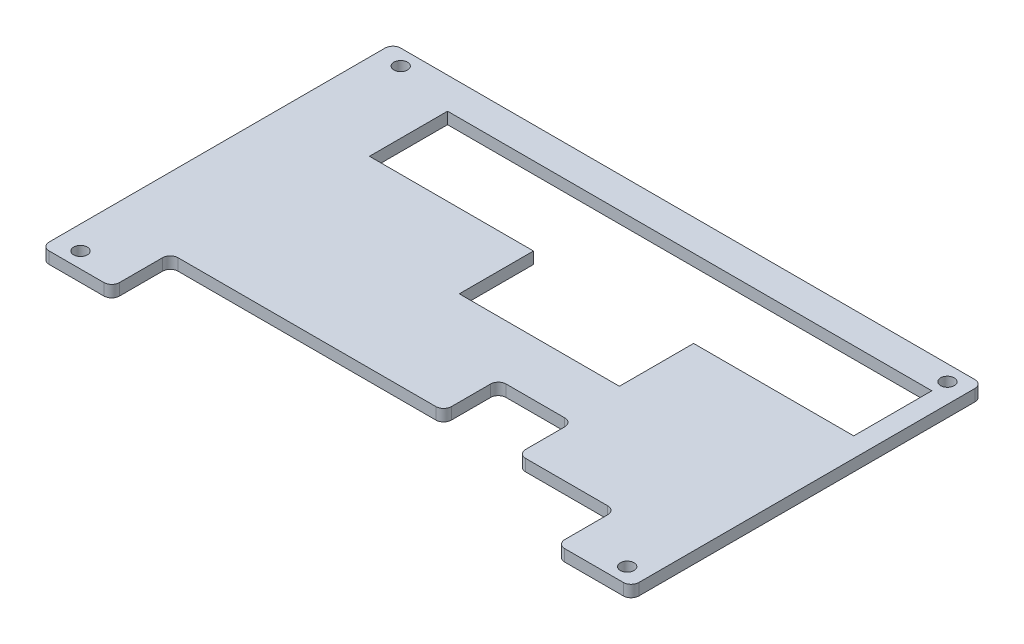
ISO-10303-21;
HEADER;
FILE_DESCRIPTION(('STEP AP214'),'2;1');
FILE_NAME('part.step','',(''),(''),'','','');
FILE_SCHEMA(('AUTOMOTIVE_DESIGN { 1 0 10303 214 1 1 1 1 }'));
ENDSEC;
DATA;
#1=APPLICATION_CONTEXT('core data for automotive mechanical design processes');
#2=APPLICATION_PROTOCOL_DEFINITION('international standard','automotive_design',2000,#1);
#3=PRODUCT_CONTEXT('',#1,'mechanical');
#4=PRODUCT('Part','Part','',(#3));
#5=PRODUCT_RELATED_PRODUCT_CATEGORY('part','',(#4));
#6=PRODUCT_DEFINITION_FORMATION('','',#4);
#7=PRODUCT_DEFINITION_CONTEXT('part definition',#1,'design');
#8=PRODUCT_DEFINITION('design','',#6,#7);
#9=PRODUCT_DEFINITION_SHAPE('','',#8);
#10=(LENGTH_UNIT() NAMED_UNIT(*) SI_UNIT(.MILLI.,.METRE.));
#11=(NAMED_UNIT(*) PLANE_ANGLE_UNIT() SI_UNIT($,.RADIAN.));
#12=(NAMED_UNIT(*) SI_UNIT($,.STERADIAN.) SOLID_ANGLE_UNIT());
#13=UNCERTAINTY_MEASURE_WITH_UNIT(LENGTH_MEASURE(1.E-05),#10,'distance_accuracy_value','');
#14=(GEOMETRIC_REPRESENTATION_CONTEXT(3) GLOBAL_UNCERTAINTY_ASSIGNED_CONTEXT((#13)) GLOBAL_UNIT_ASSIGNED_CONTEXT((#10,
#11,#12)) REPRESENTATION_CONTEXT('',''));
#15=CARTESIAN_POINT('',(0.,0.,0.));
#16=DIRECTION('',(0.,0.,1.));
#17=DIRECTION('',(1.,0.,0.));
#18=AXIS2_PLACEMENT_3D('',#15,#16,#17);
#19=CARTESIAN_POINT('',(0.,3.,0.));
#20=DIRECTION('',(0.,0.,-1.));
#21=DIRECTION('',(-1.,0.,0.));
#22=AXIS2_PLACEMENT_3D('',#19,#20,#21);
#23=PLANE('',#22);
#24=DIRECTION('',(1.,0.,0.));
#25=VECTOR('',#24,1.);
#26=CARTESIAN_POINT('',(0.,0.,0.));
#27=LINE('',#26,#25);
#28=CARTESIAN_POINT('',(2.,0.,0.));
#29=VERTEX_POINT('',#28);
#30=CARTESIAN_POINT('',(16.,0.,0.));
#31=VERTEX_POINT('',#30);
#32=EDGE_CURVE('E463',#29,#31,#27,.T.);
#33=ORIENTED_EDGE('',*,*,#32,.T.);
#34=DIRECTION('',(0.,1.,0.));
#35=VECTOR('',#34,1.);
#36=CARTESIAN_POINT('',(16.,3.,0.));
#37=LINE('',#36,#35);
#38=CARTESIAN_POINT('',(16.,3.,0.));
#39=VERTEX_POINT('',#38);
#40=EDGE_CURVE('E601',#31,#39,#37,.T.);
#41=ORIENTED_EDGE('',*,*,#40,.T.);
#42=DIRECTION('',(1.,0.,0.));
#43=VECTOR('',#42,1.);
#44=CARTESIAN_POINT('',(0.,3.,0.));
#45=LINE('',#44,#43);
#46=CARTESIAN_POINT('',(2.,3.,0.));
#47=VERTEX_POINT('',#46);
#48=EDGE_CURVE('E446',#47,#39,#45,.T.);
#49=ORIENTED_EDGE('',*,*,#48,.F.);
#50=DIRECTION('',(0.,-1.,0.));
#51=VECTOR('',#50,1.);
#52=CARTESIAN_POINT('',(2.,3.,0.));
#53=LINE('',#52,#51);
#54=EDGE_CURVE('E512',#47,#29,#53,.T.);
#55=ORIENTED_EDGE('',*,*,#54,.T.);
#56=EDGE_LOOP('',(#33,#41,#49,#55));
#57=FACE_BOUND('',#56,.T.);
#58=ADVANCED_FACE('F45',(#57),#23,.F.);
#59=CARTESIAN_POINT('',(0.,3.,0.));
#60=DIRECTION('',(1.,0.,0.));
#61=DIRECTION('',(0.,0.,-1.));
#62=AXIS2_PLACEMENT_3D('',#59,#60,#61);
#63=PLANE('',#62);
#64=DIRECTION('',(0.,0.,1.));
#65=VECTOR('',#64,1.);
#66=CARTESIAN_POINT('',(0.,0.,0.));
#67=LINE('',#66,#65);
#68=CARTESIAN_POINT('',(0.,0.,-88.));
#69=VERTEX_POINT('',#68);
#70=CARTESIAN_POINT('',(0.,0.,-2.));
#71=VERTEX_POINT('',#70);
#72=EDGE_CURVE('E436',#69,#71,#67,.T.);
#73=ORIENTED_EDGE('',*,*,#72,.T.);
#74=DIRECTION('',(0.,-1.,0.));
#75=VECTOR('',#74,1.);
#76=CARTESIAN_POINT('',(0.,3.,-2.));
#77=LINE('',#76,#75);
#78=CARTESIAN_POINT('',(0.,3.,-2.));
#79=VERTEX_POINT('',#78);
#80=EDGE_CURVE('E524',#71,#79,#77,.F.);
#81=ORIENTED_EDGE('',*,*,#80,.T.);
#82=DIRECTION('',(0.,0.,1.));
#83=VECTOR('',#82,1.);
#84=CARTESIAN_POINT('',(0.,3.,0.));
#85=LINE('',#84,#83);
#86=CARTESIAN_POINT('',(0.,3.,-88.));
#87=VERTEX_POINT('',#86);
#88=EDGE_CURVE('E440',#87,#79,#85,.T.);
#89=ORIENTED_EDGE('',*,*,#88,.F.);
#90=DIRECTION('',(0.,-1.,0.));
#91=VECTOR('',#90,1.);
#92=CARTESIAN_POINT('',(0.,3.,-88.));
#93=LINE('',#92,#91);
#94=EDGE_CURVE('E520',#87,#69,#93,.T.);
#95=ORIENTED_EDGE('',*,*,#94,.T.);
#96=EDGE_LOOP('',(#73,#81,#89,#95));
#97=FACE_BOUND('',#96,.T.);
#98=ADVANCED_FACE('F653',(#97),#63,.F.);
#99=CARTESIAN_POINT('',(134.,3.,0.));
#100=VERTEX_POINT('',#99);
#101=CARTESIAN_POINT('',(149.,3.,0.));
#102=VERTEX_POINT('',#101);
#103=EDGE_CURVE('E444',#100,#102,#45,.T.);
#104=ORIENTED_EDGE('',*,*,#103,.F.);
#105=DIRECTION('',(0.,1.,0.));
#106=VECTOR('',#105,1.);
#107=CARTESIAN_POINT('',(134.,3.,0.));
#108=LINE('',#107,#106);
#109=CARTESIAN_POINT('',(134.,0.,0.));
#110=VERTEX_POINT('',#109);
#111=EDGE_CURVE('E546',#100,#110,#108,.F.);
#112=ORIENTED_EDGE('',*,*,#111,.T.);
#113=CARTESIAN_POINT('',(149.,0.,0.));
#114=VERTEX_POINT('',#113);
#115=EDGE_CURVE('E462',#110,#114,#27,.T.);
#116=ORIENTED_EDGE('',*,*,#115,.T.);
#117=DIRECTION('',(0.,-1.,0.));
#118=VECTOR('',#117,1.);
#119=CARTESIAN_POINT('',(149.,3.,0.));
#120=LINE('',#119,#118);
#121=EDGE_CURVE('E516',#114,#102,#120,.F.);
#122=ORIENTED_EDGE('',*,*,#121,.T.);
#123=EDGE_LOOP('',(#104,#112,#116,#122));
#124=FACE_BOUND('',#123,.T.);
#125=ADVANCED_FACE('F737',(#124),#23,.F.);
#126=CARTESIAN_POINT('',(151.,3.,0.));
#127=DIRECTION('',(-1.,0.,0.));
#128=DIRECTION('',(0.,0.,1.));
#129=AXIS2_PLACEMENT_3D('',#126,#127,#128);
#130=PLANE('',#129);
#131=DIRECTION('',(0.,0.,-1.));
#132=VECTOR('',#131,1.);
#133=CARTESIAN_POINT('',(151.,0.,0.));
#134=LINE('',#133,#132);
#135=CARTESIAN_POINT('',(151.,0.,-2.));
#136=VERTEX_POINT('',#135);
#137=CARTESIAN_POINT('',(151.,0.,-88.));
#138=VERTEX_POINT('',#137);
#139=EDGE_CURVE('E467',#136,#138,#134,.T.);
#140=ORIENTED_EDGE('',*,*,#139,.T.);
#141=DIRECTION('',(0.,-1.,0.));
#142=VECTOR('',#141,1.);
#143=CARTESIAN_POINT('',(151.,3.,-88.));
#144=LINE('',#143,#142);
#145=CARTESIAN_POINT('',(151.,3.,-88.));
#146=VERTEX_POINT('',#145);
#147=EDGE_CURVE('E497',#138,#146,#144,.F.);
#148=ORIENTED_EDGE('',*,*,#147,.T.);
#149=DIRECTION('',(0.,0.,-1.));
#150=VECTOR('',#149,1.);
#151=CARTESIAN_POINT('',(151.,3.,0.));
#152=LINE('',#151,#150);
#153=CARTESIAN_POINT('',(151.,3.,-2.));
#154=VERTEX_POINT('',#153);
#155=EDGE_CURVE('E450',#154,#146,#152,.T.);
#156=ORIENTED_EDGE('',*,*,#155,.F.);
#157=DIRECTION('',(0.,-1.,0.));
#158=VECTOR('',#157,1.);
#159=CARTESIAN_POINT('',(151.,3.,-2.));
#160=LINE('',#159,#158);
#161=EDGE_CURVE('E493',#154,#136,#160,.T.);
#162=ORIENTED_EDGE('',*,*,#161,.T.);
#163=EDGE_LOOP('',(#140,#148,#156,#162));
#164=FACE_BOUND('',#163,.T.);
#165=ADVANCED_FACE('F671',(#164),#130,.F.);
#166=CARTESIAN_POINT('',(0.,3.,-90.));
#167=DIRECTION('',(0.,0.,1.));
#168=DIRECTION('',(1.,0.,0.));
#169=AXIS2_PLACEMENT_3D('',#166,#167,#168);
#170=PLANE('',#169);
#171=DIRECTION('',(-1.,0.,0.));
#172=VECTOR('',#171,1.);
#173=CARTESIAN_POINT('',(0.,3.,-90.));
#174=LINE('',#173,#172);
#175=CARTESIAN_POINT('',(149.,3.,-90.));
#176=VERTEX_POINT('',#175);
#177=CARTESIAN_POINT('',(2.,3.,-90.));
#178=VERTEX_POINT('',#177);
#179=EDGE_CURVE('E454',#176,#178,#174,.T.);
#180=ORIENTED_EDGE('',*,*,#179,.F.);
#181=DIRECTION('',(0.,-1.,0.));
#182=VECTOR('',#181,1.);
#183=CARTESIAN_POINT('',(149.,3.,-90.));
#184=LINE('',#183,#182);
#185=CARTESIAN_POINT('',(149.,0.,-90.));
#186=VERTEX_POINT('',#185);
#187=EDGE_CURVE('E476',#176,#186,#184,.T.);
#188=ORIENTED_EDGE('',*,*,#187,.T.);
#189=DIRECTION('',(-1.,0.,0.));
#190=VECTOR('',#189,1.);
#191=CARTESIAN_POINT('',(0.,0.,-90.));
#192=LINE('',#191,#190);
#193=CARTESIAN_POINT('',(2.,0.,-90.));
#194=VERTEX_POINT('',#193);
#195=EDGE_CURVE('E445',#186,#194,#192,.T.);
#196=ORIENTED_EDGE('',*,*,#195,.T.);
#197=DIRECTION('',(0.,-1.,0.));
#198=VECTOR('',#197,1.);
#199=CARTESIAN_POINT('',(2.,3.,-90.));
#200=LINE('',#199,#198);
#201=EDGE_CURVE('E458',#194,#178,#200,.F.);
#202=ORIENTED_EDGE('',*,*,#201,.T.);
#203=EDGE_LOOP('',(#180,#188,#196,#202));
#204=FACE_BOUND('',#203,.T.);
#205=ADVANCED_FACE('F663',(#204),#170,.F.);
#206=CARTESIAN_POINT('',(0.,3.,0.));
#207=DIRECTION('',(0.,-1.,0.));
#208=DIRECTION('',(0.,0.,-1.));
#209=AXIS2_PLACEMENT_3D('',#206,#207,#208);
#210=PLANE('',#209);
#211=DIRECTION('',(1.,0.,0.));
#212=VECTOR('',#211,1.);
#213=CARTESIAN_POINT('',(22.,3.,-62.));
#214=LINE('',#213,#212);
#215=CARTESIAN_POINT('',(22.,3.,-62.));
#216=VERTEX_POINT('',#215);
#217=CARTESIAN_POINT('',(64.,3.,-62.));
#218=VERTEX_POINT('',#217);
#219=EDGE_CURVE('E312',#216,#218,#214,.T.);
#220=ORIENTED_EDGE('',*,*,#219,.F.);
#221=DIRECTION('',(0.,0.,1.));
#222=VECTOR('',#221,1.);
#223=CARTESIAN_POINT('',(22.,3.,-82.));
#224=LINE('',#223,#222);
#225=CARTESIAN_POINT('',(22.,3.,-82.));
#226=VERTEX_POINT('',#225);
#227=EDGE_CURVE('E263',#226,#216,#224,.T.);
#228=ORIENTED_EDGE('',*,*,#227,.F.);
#229=DIRECTION('',(-1.,0.,0.));
#230=VECTOR('',#229,1.);
#231=CARTESIAN_POINT('',(22.,3.,-82.));
#232=LINE('',#231,#230);
#233=CARTESIAN_POINT('',(146.,3.,-82.));
#234=VERTEX_POINT('',#233);
#235=EDGE_CURVE('E284',#234,#226,#232,.T.);
#236=ORIENTED_EDGE('',*,*,#235,.F.);
#237=DIRECTION('',(0.,0.,-1.));
#238=VECTOR('',#237,1.);
#239=CARTESIAN_POINT('',(146.,3.,-82.));
#240=LINE('',#239,#238);
#241=CARTESIAN_POINT('',(146.,3.,-62.));
#242=VERTEX_POINT('',#241);
#243=EDGE_CURVE('E288',#242,#234,#240,.T.);
#244=ORIENTED_EDGE('',*,*,#243,.F.);
#245=DIRECTION('',(1.,0.,0.));
#246=VECTOR('',#245,1.);
#247=CARTESIAN_POINT('',(105.,3.,-62.));
#248=LINE('',#247,#246);
#249=CARTESIAN_POINT('',(105.,3.,-62.));
#250=VERTEX_POINT('',#249);
#251=EDGE_CURVE('E328',#250,#242,#248,.T.);
#252=ORIENTED_EDGE('',*,*,#251,.F.);
#253=DIRECTION('',(0.,0.,-1.));
#254=VECTOR('',#253,1.);
#255=CARTESIAN_POINT('',(105.,3.,-62.));
#256=LINE('',#255,#254);
#257=CARTESIAN_POINT('',(105.,3.,-43.));
#258=VERTEX_POINT('',#257);
#259=EDGE_CURVE('E324',#258,#250,#256,.T.);
#260=ORIENTED_EDGE('',*,*,#259,.F.);
#261=DIRECTION('',(1.,0.,0.));
#262=VECTOR('',#261,1.);
#263=CARTESIAN_POINT('',(64.,3.,-43.));
#264=LINE('',#263,#262);
#265=CARTESIAN_POINT('',(64.,3.,-43.));
#266=VERTEX_POINT('',#265);
#267=EDGE_CURVE('E320',#266,#258,#264,.T.);
#268=ORIENTED_EDGE('',*,*,#267,.F.);
#269=DIRECTION('',(0.,0.,1.));
#270=VECTOR('',#269,1.);
#271=CARTESIAN_POINT('',(64.,3.,-62.));
#272=LINE('',#271,#270);
#273=EDGE_CURVE('E316',#218,#266,#272,.T.);
#274=ORIENTED_EDGE('',*,*,#273,.F.);
#275=EDGE_LOOP('',(#220,#228,#236,#244,#252,#260,#268,#274));
#276=FACE_BOUND('',#275,.T.);
#277=CARTESIAN_POINT('',(146.,3.,-4.));
#278=DIRECTION('',(0.,1.,0.));
#279=DIRECTION('',(0.,0.,1.));
#280=AXIS2_PLACEMENT_3D('',#277,#278,#279);
#281=CIRCLE('',#280,1.75000000000001);
#282=CARTESIAN_POINT('',(146.,3.,-2.24999999999999));
#283=VERTEX_POINT('',#282);
#284=EDGE_CURVE('E416',#283,#283,#281,.T.);
#285=ORIENTED_EDGE('',*,*,#284,.F.);
#286=EDGE_LOOP('',(#285));
#287=FACE_BOUND('',#286,.T.);
#288=CARTESIAN_POINT('',(6.,3.,-86.));
#289=DIRECTION('',(0.,1.,0.));
#290=DIRECTION('',(0.,0.,1.));
#291=AXIS2_PLACEMENT_3D('',#288,#289,#290);
#292=CIRCLE('',#291,1.75);
#293=CARTESIAN_POINT('',(6.,3.,-84.25));
#294=VERTEX_POINT('',#293);
#295=EDGE_CURVE('E425',#294,#294,#292,.T.);
#296=ORIENTED_EDGE('',*,*,#295,.F.);
#297=EDGE_LOOP('',(#296));
#298=FACE_BOUND('',#297,.T.);
#299=CARTESIAN_POINT('',(6.,3.,-4.));
#300=DIRECTION('',(0.,1.,0.));
#301=DIRECTION('',(0.,0.,1.));
#302=AXIS2_PLACEMENT_3D('',#299,#300,#301);
#303=CIRCLE('',#302,1.75);
#304=CARTESIAN_POINT('',(6.,3.,-2.25));
#305=VERTEX_POINT('',#304);
#306=EDGE_CURVE('E408',#305,#305,#303,.T.);
#307=ORIENTED_EDGE('',*,*,#306,.F.);
#308=EDGE_LOOP('',(#307));
#309=FACE_BOUND('',#308,.T.);
#310=CARTESIAN_POINT('',(146.,3.,-86.));
#311=DIRECTION('',(0.,1.,0.));
#312=DIRECTION('',(0.,0.,1.));
#313=AXIS2_PLACEMENT_3D('',#310,#311,#312);
#314=CIRCLE('',#313,1.75000000000001);
#315=CARTESIAN_POINT('',(146.,3.,-84.25));
#316=VERTEX_POINT('',#315);
#317=EDGE_CURVE('E420',#316,#316,#314,.T.);
#318=ORIENTED_EDGE('',*,*,#317,.F.);
#319=EDGE_LOOP('',(#318));
#320=FACE_BOUND('',#319,.T.);
#321=DIRECTION('',(0.,0.,-1.));
#322=VECTOR('',#321,1.);
#323=CARTESIAN_POINT('',(132.,3.,0.));
#324=LINE('',#323,#322);
#325=CARTESIAN_POINT('',(132.,3.,-2.));
#326=VERTEX_POINT('',#325);
#327=CARTESIAN_POINT('',(132.,3.,-13.));
#328=VERTEX_POINT('',#327);
#329=EDGE_CURVE('E376',#326,#328,#324,.T.);
#330=ORIENTED_EDGE('',*,*,#329,.F.);
#331=CARTESIAN_POINT('',(134.,3.,-2.));
#332=DIRECTION('',(0.,-1.,0.));
#333=DIRECTION('',(0.,0.,-1.));
#334=AXIS2_PLACEMENT_3D('',#331,#332,#333);
#335=CIRCLE('',#334,2.);
#336=EDGE_CURVE('E543',#326,#100,#335,.F.);
#337=ORIENTED_EDGE('',*,*,#336,.T.);
#338=ORIENTED_EDGE('',*,*,#103,.T.);
#339=CARTESIAN_POINT('',(149.,3.,-2.));
#340=DIRECTION('',(0.,-1.,0.));
#341=DIRECTION('',(0.,0.,-1.));
#342=AXIS2_PLACEMENT_3D('',#339,#340,#341);
#343=CIRCLE('',#342,2.);
#344=EDGE_CURVE('E506',#102,#154,#343,.F.);
#345=ORIENTED_EDGE('',*,*,#344,.T.);
#346=ORIENTED_EDGE('',*,*,#155,.T.);
#347=CARTESIAN_POINT('',(149.,3.,-88.));
#348=DIRECTION('',(0.,-1.,0.));
#349=DIRECTION('',(0.,0.,-1.));
#350=AXIS2_PLACEMENT_3D('',#347,#348,#349);
#351=CIRCLE('',#350,2.);
#352=EDGE_CURVE('E509',#146,#176,#351,.F.);
#353=ORIENTED_EDGE('',*,*,#352,.T.);
#354=ORIENTED_EDGE('',*,*,#179,.T.);
#355=CARTESIAN_POINT('',(2.,3.,-88.));
#356=DIRECTION('',(0.,-1.,0.));
#357=DIRECTION('',(0.,0.,-1.));
#358=AXIS2_PLACEMENT_3D('',#355,#356,#357);
#359=CIRCLE('',#358,2.);
#360=EDGE_CURVE('E500',#178,#87,#359,.F.);
#361=ORIENTED_EDGE('',*,*,#360,.T.);
#362=ORIENTED_EDGE('',*,*,#88,.T.);
#363=CARTESIAN_POINT('',(2.,3.,-2.));
#364=DIRECTION('',(0.,-1.,0.));
#365=DIRECTION('',(0.,0.,-1.));
#366=AXIS2_PLACEMENT_3D('',#363,#364,#365);
#367=CIRCLE('',#366,2.);
#368=EDGE_CURVE('E503',#79,#47,#367,.F.);
#369=ORIENTED_EDGE('',*,*,#368,.T.);
#370=ORIENTED_EDGE('',*,*,#48,.T.);
#371=CARTESIAN_POINT('',(16.,3.,-2.));
#372=DIRECTION('',(0.,-1.,0.));
#373=DIRECTION('',(0.,0.,-1.));
#374=AXIS2_PLACEMENT_3D('',#371,#372,#373);
#375=CIRCLE('',#374,2.);
#376=CARTESIAN_POINT('',(18.,3.,-2.));
#377=VERTEX_POINT('',#376);
#378=EDGE_CURVE('E534',#39,#377,#375,.F.);
#379=ORIENTED_EDGE('',*,*,#378,.T.);
#380=DIRECTION('',(0.,0.,1.));
#381=VECTOR('',#380,1.);
#382=CARTESIAN_POINT('',(18.,3.,0.));
#383=LINE('',#382,#381);
#384=CARTESIAN_POINT('',(18.,3.,-13.));
#385=VERTEX_POINT('',#384);
#386=EDGE_CURVE('E313',#385,#377,#383,.T.);
#387=ORIENTED_EDGE('',*,*,#386,.F.);
#388=CARTESIAN_POINT('',(20.,3.,-13.));
#389=DIRECTION('',(0.,-1.,0.));
#390=DIRECTION('',(0.,0.,-1.));
#391=AXIS2_PLACEMENT_3D('',#388,#389,#390);
#392=CIRCLE('',#391,2.);
#393=CARTESIAN_POINT('',(20.,3.,-15.));
#394=VERTEX_POINT('',#393);
#395=EDGE_CURVE('E54',#385,#394,#392,.T.);
#396=ORIENTED_EDGE('',*,*,#395,.T.);
#397=DIRECTION('',(-1.,0.,0.));
#398=VECTOR('',#397,1.);
#399=CARTESIAN_POINT('',(18.,3.,-15.));
#400=LINE('',#399,#398);
#401=CARTESIAN_POINT('',(86.,3.,-15.));
#402=VERTEX_POINT('',#401);
#403=EDGE_CURVE('E356',#402,#394,#400,.T.);
#404=ORIENTED_EDGE('',*,*,#403,.F.);
#405=CARTESIAN_POINT('',(86.,3.,-17.));
#406=DIRECTION('',(0.,-1.,0.));
#407=DIRECTION('',(0.,0.,-1.));
#408=AXIS2_PLACEMENT_3D('',#405,#406,#407);
#409=CIRCLE('',#408,2.);
#410=CARTESIAN_POINT('',(88.,3.,-17.));
#411=VERTEX_POINT('',#410);
#412=EDGE_CURVE('E537',#402,#411,#409,.F.);
#413=ORIENTED_EDGE('',*,*,#412,.T.);
#414=DIRECTION('',(0.,0.,1.));
#415=VECTOR('',#414,1.);
#416=CARTESIAN_POINT('',(88.,3.,-15.));
#417=LINE('',#416,#415);
#418=CARTESIAN_POINT('',(88.,3.,-27.));
#419=VERTEX_POINT('',#418);
#420=EDGE_CURVE('E359',#419,#411,#417,.T.);
#421=ORIENTED_EDGE('',*,*,#420,.F.);
#422=CARTESIAN_POINT('',(90.,3.,-27.));
#423=DIRECTION('',(0.,-1.,0.));
#424=DIRECTION('',(0.,0.,-1.));
#425=AXIS2_PLACEMENT_3D('',#422,#423,#424);
#426=CIRCLE('',#425,2.);
#427=CARTESIAN_POINT('',(90.,3.,-29.));
#428=VERTEX_POINT('',#427);
#429=EDGE_CURVE('E617',#419,#428,#426,.T.);
#430=ORIENTED_EDGE('',*,*,#429,.T.);
#431=DIRECTION('',(-1.,0.,0.));
#432=VECTOR('',#431,1.);
#433=CARTESIAN_POINT('',(88.,3.,-29.));
#434=LINE('',#433,#432);
#435=CARTESIAN_POINT('',(105.,3.,-29.));
#436=VERTEX_POINT('',#435);
#437=EDGE_CURVE('E364',#436,#428,#434,.T.);
#438=ORIENTED_EDGE('',*,*,#437,.F.);
#439=CARTESIAN_POINT('',(105.,3.,-27.));
#440=DIRECTION('',(0.,-1.,0.));
#441=DIRECTION('',(0.,0.,-1.));
#442=AXIS2_PLACEMENT_3D('',#439,#440,#441);
#443=CIRCLE('',#442,2.);
#444=CARTESIAN_POINT('',(107.,3.,-27.));
#445=VERTEX_POINT('',#444);
#446=EDGE_CURVE('E611',#436,#445,#443,.T.);
#447=ORIENTED_EDGE('',*,*,#446,.T.);
#448=DIRECTION('',(0.,0.,-1.));
#449=VECTOR('',#448,1.);
#450=CARTESIAN_POINT('',(107.,3.,-15.));
#451=LINE('',#450,#449);
#452=CARTESIAN_POINT('',(107.,3.,-17.));
#453=VERTEX_POINT('',#452);
#454=EDGE_CURVE('E368',#453,#445,#451,.T.);
#455=ORIENTED_EDGE('',*,*,#454,.F.);
#456=CARTESIAN_POINT('',(109.,3.,-17.));
#457=DIRECTION('',(0.,-1.,0.));
#458=DIRECTION('',(0.,0.,-1.));
#459=AXIS2_PLACEMENT_3D('',#456,#457,#458);
#460=CIRCLE('',#459,2.);
#461=CARTESIAN_POINT('',(109.,3.,-15.));
#462=VERTEX_POINT('',#461);
#463=EDGE_CURVE('E540',#453,#462,#460,.F.);
#464=ORIENTED_EDGE('',*,*,#463,.T.);
#465=DIRECTION('',(-1.,0.,0.));
#466=VECTOR('',#465,1.);
#467=CARTESIAN_POINT('',(107.,3.,-15.));
#468=LINE('',#467,#466);
#469=CARTESIAN_POINT('',(130.,3.,-15.));
#470=VERTEX_POINT('',#469);
#471=EDGE_CURVE('E372',#470,#462,#468,.T.);
#472=ORIENTED_EDGE('',*,*,#471,.F.);
#473=CARTESIAN_POINT('',(130.,3.,-13.));
#474=DIRECTION('',(0.,-1.,0.));
#475=DIRECTION('',(0.,0.,-1.));
#476=AXIS2_PLACEMENT_3D('',#473,#474,#475);
#477=CIRCLE('',#476,2.);
#478=EDGE_CURVE('E605',#470,#328,#477,.T.);
#479=ORIENTED_EDGE('',*,*,#478,.T.);
#480=EDGE_LOOP('',(#330,#337,#338,#345,#346,#353,#354,#361,#362,#369,#370,#379,#387,#396,#404,
#413,#421,#430,#438,#447,#455,#464,#472,#479));
#481=FACE_BOUND('',#480,.T.);
#482=ADVANCED_FACE('F627',(#276,#287,#298,#309,#320,#481),#210,.F.);
#483=CARTESIAN_POINT('',(0.,0.,0.));
#484=DIRECTION('',(0.,-1.,0.));
#485=DIRECTION('',(0.,0.,-1.));
#486=AXIS2_PLACEMENT_3D('',#483,#484,#485);
#487=PLANE('',#486);
#488=DIRECTION('',(0.,0.,1.));
#489=VECTOR('',#488,1.);
#490=CARTESIAN_POINT('',(22.,0.,-82.));
#491=LINE('',#490,#489);
#492=CARTESIAN_POINT('',(22.,0.,-82.));
#493=VERTEX_POINT('',#492);
#494=CARTESIAN_POINT('',(22.,0.,-62.));
#495=VERTEX_POINT('',#494);
#496=EDGE_CURVE('E260',#493,#495,#491,.T.);
#497=ORIENTED_EDGE('',*,*,#496,.T.);
#498=DIRECTION('',(1.,0.,0.));
#499=VECTOR('',#498,1.);
#500=CARTESIAN_POINT('',(22.,0.,-62.));
#501=LINE('',#500,#499);
#502=CARTESIAN_POINT('',(64.,0.,-62.));
#503=VERTEX_POINT('',#502);
#504=EDGE_CURVE('E273',#495,#503,#501,.T.);
#505=ORIENTED_EDGE('',*,*,#504,.T.);
#506=DIRECTION('',(0.,0.,1.));
#507=VECTOR('',#506,1.);
#508=CARTESIAN_POINT('',(64.,0.,-62.));
#509=LINE('',#508,#507);
#510=CARTESIAN_POINT('',(64.,0.,-43.));
#511=VERTEX_POINT('',#510);
#512=EDGE_CURVE('E278',#503,#511,#509,.T.);
#513=ORIENTED_EDGE('',*,*,#512,.T.);
#514=DIRECTION('',(1.,0.,0.));
#515=VECTOR('',#514,1.);
#516=CARTESIAN_POINT('',(64.,0.,-43.));
#517=LINE('',#516,#515);
#518=CARTESIAN_POINT('',(105.,0.,-43.));
#519=VERTEX_POINT('',#518);
#520=EDGE_CURVE('E293',#511,#519,#517,.T.);
#521=ORIENTED_EDGE('',*,*,#520,.T.);
#522=DIRECTION('',(0.,0.,-1.));
#523=VECTOR('',#522,1.);
#524=CARTESIAN_POINT('',(105.,0.,-62.));
#525=LINE('',#524,#523);
#526=CARTESIAN_POINT('',(105.,0.,-62.));
#527=VERTEX_POINT('',#526);
#528=EDGE_CURVE('E297',#519,#527,#525,.T.);
#529=ORIENTED_EDGE('',*,*,#528,.T.);
#530=DIRECTION('',(1.,0.,0.));
#531=VECTOR('',#530,1.);
#532=CARTESIAN_POINT('',(105.,0.,-62.));
#533=LINE('',#532,#531);
#534=CARTESIAN_POINT('',(146.,0.,-62.));
#535=VERTEX_POINT('',#534);
#536=EDGE_CURVE('E301',#527,#535,#533,.T.);
#537=ORIENTED_EDGE('',*,*,#536,.T.);
#538=DIRECTION('',(0.,0.,-1.));
#539=VECTOR('',#538,1.);
#540=CARTESIAN_POINT('',(146.,0.,-82.));
#541=LINE('',#540,#539);
#542=CARTESIAN_POINT('',(146.,0.,-82.));
#543=VERTEX_POINT('',#542);
#544=EDGE_CURVE('E305',#535,#543,#541,.T.);
#545=ORIENTED_EDGE('',*,*,#544,.T.);
#546=DIRECTION('',(-1.,0.,0.));
#547=VECTOR('',#546,1.);
#548=CARTESIAN_POINT('',(22.,0.,-82.));
#549=LINE('',#548,#547);
#550=EDGE_CURVE('E269',#543,#493,#549,.T.);
#551=ORIENTED_EDGE('',*,*,#550,.T.);
#552=EDGE_LOOP('',(#497,#505,#513,#521,#529,#537,#545,#551));
#553=FACE_BOUND('',#552,.T.);
#554=ORIENTED_EDGE('',*,*,#115,.F.);
#555=CARTESIAN_POINT('',(134.,0.,-2.));
#556=DIRECTION('',(0.,-1.,0.));
#557=DIRECTION('',(0.,0.,-1.));
#558=AXIS2_PLACEMENT_3D('',#555,#556,#557);
#559=CIRCLE('',#558,2.);
#560=CARTESIAN_POINT('',(132.,0.,-2.));
#561=VERTEX_POINT('',#560);
#562=EDGE_CURVE('E557',#110,#561,#559,.T.);
#563=ORIENTED_EDGE('',*,*,#562,.T.);
#564=DIRECTION('',(0.,0.,-1.));
#565=VECTOR('',#564,1.);
#566=CARTESIAN_POINT('',(132.,0.,0.));
#567=LINE('',#566,#565);
#568=CARTESIAN_POINT('',(132.,0.,-13.));
#569=VERTEX_POINT('',#568);
#570=EDGE_CURVE('E401',#561,#569,#567,.T.);
#571=ORIENTED_EDGE('',*,*,#570,.T.);
#572=CARTESIAN_POINT('',(130.,0.,-13.));
#573=DIRECTION('',(0.,-1.,0.));
#574=DIRECTION('',(0.,0.,-1.));
#575=AXIS2_PLACEMENT_3D('',#572,#573,#574);
#576=CIRCLE('',#575,2.);
#577=CARTESIAN_POINT('',(130.,0.,-15.));
#578=VERTEX_POINT('',#577);
#579=EDGE_CURVE('E608',#569,#578,#576,.F.);
#580=ORIENTED_EDGE('',*,*,#579,.T.);
#581=DIRECTION('',(-1.,0.,0.));
#582=VECTOR('',#581,1.);
#583=CARTESIAN_POINT('',(107.,0.,-15.));
#584=LINE('',#583,#582);
#585=CARTESIAN_POINT('',(109.,0.,-15.));
#586=VERTEX_POINT('',#585);
#587=EDGE_CURVE('E397',#578,#586,#584,.T.);
#588=ORIENTED_EDGE('',*,*,#587,.T.);
#589=CARTESIAN_POINT('',(109.,0.,-17.));
#590=DIRECTION('',(0.,-1.,0.));
#591=DIRECTION('',(0.,0.,-1.));
#592=AXIS2_PLACEMENT_3D('',#589,#590,#591);
#593=CIRCLE('',#592,2.);
#594=CARTESIAN_POINT('',(107.,0.,-17.));
#595=VERTEX_POINT('',#594);
#596=EDGE_CURVE('E554',#586,#595,#593,.T.);
#597=ORIENTED_EDGE('',*,*,#596,.T.);
#598=DIRECTION('',(0.,0.,-1.));
#599=VECTOR('',#598,1.);
#600=CARTESIAN_POINT('',(107.,0.,-15.));
#601=LINE('',#600,#599);
#602=CARTESIAN_POINT('',(107.,0.,-27.));
#603=VERTEX_POINT('',#602);
#604=EDGE_CURVE('E393',#595,#603,#601,.T.);
#605=ORIENTED_EDGE('',*,*,#604,.T.);
#606=CARTESIAN_POINT('',(105.,0.,-27.));
#607=DIRECTION('',(0.,-1.,0.));
#608=DIRECTION('',(0.,0.,-1.));
#609=AXIS2_PLACEMENT_3D('',#606,#607,#608);
#610=CIRCLE('',#609,2.);
#611=CARTESIAN_POINT('',(105.,0.,-29.));
#612=VERTEX_POINT('',#611);
#613=EDGE_CURVE('E614',#603,#612,#610,.F.);
#614=ORIENTED_EDGE('',*,*,#613,.T.);
#615=DIRECTION('',(-1.,0.,0.));
#616=VECTOR('',#615,1.);
#617=CARTESIAN_POINT('',(88.,0.,-29.));
#618=LINE('',#617,#616);
#619=CARTESIAN_POINT('',(90.,0.,-29.));
#620=VERTEX_POINT('',#619);
#621=EDGE_CURVE('E389',#612,#620,#618,.T.);
#622=ORIENTED_EDGE('',*,*,#621,.T.);
#623=CARTESIAN_POINT('',(90.,0.,-27.));
#624=DIRECTION('',(0.,-1.,0.));
#625=DIRECTION('',(0.,0.,-1.));
#626=AXIS2_PLACEMENT_3D('',#623,#624,#625);
#627=CIRCLE('',#626,2.);
#628=CARTESIAN_POINT('',(88.,0.,-27.));
#629=VERTEX_POINT('',#628);
#630=EDGE_CURVE('E620',#620,#629,#627,.F.);
#631=ORIENTED_EDGE('',*,*,#630,.T.);
#632=DIRECTION('',(0.,0.,1.));
#633=VECTOR('',#632,1.);
#634=CARTESIAN_POINT('',(88.,0.,-15.));
#635=LINE('',#634,#633);
#636=CARTESIAN_POINT('',(88.,0.,-17.));
#637=VERTEX_POINT('',#636);
#638=EDGE_CURVE('E386',#629,#637,#635,.T.);
#639=ORIENTED_EDGE('',*,*,#638,.T.);
#640=CARTESIAN_POINT('',(86.,0.,-17.));
#641=DIRECTION('',(0.,-1.,0.));
#642=DIRECTION('',(0.,0.,-1.));
#643=AXIS2_PLACEMENT_3D('',#640,#641,#642);
#644=CIRCLE('',#643,2.);
#645=CARTESIAN_POINT('',(86.,0.,-15.));
#646=VERTEX_POINT('',#645);
#647=EDGE_CURVE('E68',#637,#646,#644,.T.);
#648=ORIENTED_EDGE('',*,*,#647,.T.);
#649=DIRECTION('',(-1.,0.,0.));
#650=VECTOR('',#649,1.);
#651=CARTESIAN_POINT('',(18.,0.,-15.));
#652=LINE('',#651,#650);
#653=CARTESIAN_POINT('',(20.,0.,-15.));
#654=VERTEX_POINT('',#653);
#655=EDGE_CURVE('E383',#646,#654,#652,.T.);
#656=ORIENTED_EDGE('',*,*,#655,.T.);
#657=CARTESIAN_POINT('',(20.,0.,-13.));
#658=DIRECTION('',(0.,-1.,0.));
#659=DIRECTION('',(0.,0.,-1.));
#660=AXIS2_PLACEMENT_3D('',#657,#658,#659);
#661=CIRCLE('',#660,2.);
#662=CARTESIAN_POINT('',(18.,0.,-13.));
#663=VERTEX_POINT('',#662);
#664=EDGE_CURVE('E11',#654,#663,#661,.F.);
#665=ORIENTED_EDGE('',*,*,#664,.T.);
#666=DIRECTION('',(0.,0.,1.));
#667=VECTOR('',#666,1.);
#668=CARTESIAN_POINT('',(18.,0.,0.));
#669=LINE('',#668,#667);
#670=CARTESIAN_POINT('',(18.,0.,-2.));
#671=VERTEX_POINT('',#670);
#672=EDGE_CURVE('E360',#663,#671,#669,.T.);
#673=ORIENTED_EDGE('',*,*,#672,.T.);
#674=CARTESIAN_POINT('',(16.,0.,-2.));
#675=DIRECTION('',(0.,-1.,0.));
#676=DIRECTION('',(0.,0.,-1.));
#677=AXIS2_PLACEMENT_3D('',#674,#675,#676);
#678=CIRCLE('',#677,2.);
#679=EDGE_CURVE('E549',#671,#31,#678,.T.);
#680=ORIENTED_EDGE('',*,*,#679,.T.);
#681=ORIENTED_EDGE('',*,*,#32,.F.);
#682=CARTESIAN_POINT('',(2.,0.,-2.));
#683=DIRECTION('',(0.,-1.,0.));
#684=DIRECTION('',(0.,0.,-1.));
#685=AXIS2_PLACEMENT_3D('',#682,#683,#684);
#686=CIRCLE('',#685,2.);
#687=EDGE_CURVE('E483',#29,#71,#686,.T.);
#688=ORIENTED_EDGE('',*,*,#687,.T.);
#689=ORIENTED_EDGE('',*,*,#72,.F.);
#690=CARTESIAN_POINT('',(2.,0.,-88.));
#691=DIRECTION('',(0.,-1.,0.));
#692=DIRECTION('',(0.,0.,-1.));
#693=AXIS2_PLACEMENT_3D('',#690,#691,#692);
#694=CIRCLE('',#693,2.);
#695=EDGE_CURVE('E480',#69,#194,#694,.T.);
#696=ORIENTED_EDGE('',*,*,#695,.T.);
#697=ORIENTED_EDGE('',*,*,#195,.F.);
#698=CARTESIAN_POINT('',(149.,0.,-88.));
#699=DIRECTION('',(0.,-1.,0.));
#700=DIRECTION('',(0.,0.,-1.));
#701=AXIS2_PLACEMENT_3D('',#698,#699,#700);
#702=CIRCLE('',#701,2.);
#703=EDGE_CURVE('E490',#186,#138,#702,.T.);
#704=ORIENTED_EDGE('',*,*,#703,.T.);
#705=ORIENTED_EDGE('',*,*,#139,.F.);
#706=CARTESIAN_POINT('',(149.,0.,-2.));
#707=DIRECTION('',(0.,-1.,0.));
#708=DIRECTION('',(0.,0.,-1.));
#709=AXIS2_PLACEMENT_3D('',#706,#707,#708);
#710=CIRCLE('',#709,2.);
#711=EDGE_CURVE('E486',#136,#114,#710,.T.);
#712=ORIENTED_EDGE('',*,*,#711,.T.);
#713=EDGE_LOOP('',(#554,#563,#571,#580,#588,#597,#605,#614,#622,#631,#639,#648,#656,#665,#673,
#680,#681,#688,#689,#696,#697,#704,#705,#712));
#714=FACE_BOUND('',#713,.T.);
#715=CARTESIAN_POINT('',(146.,0.,-4.));
#716=DIRECTION('',(0.,1.,0.));
#717=DIRECTION('',(0.,0.,1.));
#718=AXIS2_PLACEMENT_3D('',#715,#716,#717);
#719=CIRCLE('',#718,1.75000000000001);
#720=CARTESIAN_POINT('',(146.,0.,-2.24999999999999));
#721=VERTEX_POINT('',#720);
#722=EDGE_CURVE('E421',#721,#721,#719,.T.);
#723=ORIENTED_EDGE('',*,*,#722,.T.);
#724=EDGE_LOOP('',(#723));
#725=FACE_BOUND('',#724,.T.);
#726=CARTESIAN_POINT('',(6.,0.,-86.));
#727=DIRECTION('',(0.,1.,0.));
#728=DIRECTION('',(0.,0.,1.));
#729=AXIS2_PLACEMENT_3D('',#726,#727,#728);
#730=CIRCLE('',#729,1.75);
#731=CARTESIAN_POINT('',(6.,0.,-84.25));
#732=VERTEX_POINT('',#731);
#733=EDGE_CURVE('E412',#732,#732,#730,.T.);
#734=ORIENTED_EDGE('',*,*,#733,.T.);
#735=EDGE_LOOP('',(#734));
#736=FACE_BOUND('',#735,.T.);
#737=CARTESIAN_POINT('',(6.,0.,-4.));
#738=DIRECTION('',(0.,1.,0.));
#739=DIRECTION('',(0.,0.,1.));
#740=AXIS2_PLACEMENT_3D('',#737,#738,#739);
#741=CIRCLE('',#740,1.75);
#742=CARTESIAN_POINT('',(6.,0.,-2.25));
#743=VERTEX_POINT('',#742);
#744=EDGE_CURVE('E338',#743,#743,#741,.T.);
#745=ORIENTED_EDGE('',*,*,#744,.T.);
#746=EDGE_LOOP('',(#745));
#747=FACE_BOUND('',#746,.T.);
#748=CARTESIAN_POINT('',(146.,0.,-86.));
#749=DIRECTION('',(0.,1.,0.));
#750=DIRECTION('',(0.,0.,1.));
#751=AXIS2_PLACEMENT_3D('',#748,#749,#750);
#752=CIRCLE('',#751,1.75000000000001);
#753=CARTESIAN_POINT('',(146.,0.,-84.25));
#754=VERTEX_POINT('',#753);
#755=EDGE_CURVE('E432',#754,#754,#752,.T.);
#756=ORIENTED_EDGE('',*,*,#755,.T.);
#757=EDGE_LOOP('',(#756));
#758=FACE_BOUND('',#757,.T.);
#759=ADVANCED_FACE('F280',(#553,#714,#725,#736,#747,#758),#487,.T.);
#760=CARTESIAN_POINT('',(146.,0.,-86.));
#761=DIRECTION('',(0.,1.,0.));
#762=DIRECTION('',(0.,0.,1.));
#763=AXIS2_PLACEMENT_3D('',#760,#761,#762);
#764=CYLINDRICAL_SURFACE('',#763,1.75000000000001);
#765=ORIENTED_EDGE('',*,*,#755,.F.);
#766=EDGE_LOOP('',(#765));
#767=FACE_BOUND('',#766,.T.);
#768=ORIENTED_EDGE('',*,*,#317,.T.);
#769=EDGE_LOOP('',(#768));
#770=FACE_BOUND('',#769,.T.);
#771=ADVANCED_FACE('F757',(#767,#770),#764,.F.);
#772=CARTESIAN_POINT('',(6.,0.,-4.));
#773=DIRECTION('',(0.,1.,0.));
#774=DIRECTION('',(0.,0.,1.));
#775=AXIS2_PLACEMENT_3D('',#772,#773,#774);
#776=CYLINDRICAL_SURFACE('',#775,1.75);
#777=ORIENTED_EDGE('',*,*,#744,.F.);
#778=EDGE_LOOP('',(#777));
#779=FACE_BOUND('',#778,.T.);
#780=ORIENTED_EDGE('',*,*,#306,.T.);
#781=EDGE_LOOP('',(#780));
#782=FACE_BOUND('',#781,.T.);
#783=ADVANCED_FACE('F762',(#779,#782),#776,.F.);
#784=CARTESIAN_POINT('',(6.,0.,-86.));
#785=DIRECTION('',(0.,1.,0.));
#786=DIRECTION('',(0.,0.,1.));
#787=AXIS2_PLACEMENT_3D('',#784,#785,#786);
#788=CYLINDRICAL_SURFACE('',#787,1.75);
#789=ORIENTED_EDGE('',*,*,#733,.F.);
#790=EDGE_LOOP('',(#789));
#791=FACE_BOUND('',#790,.T.);
#792=ORIENTED_EDGE('',*,*,#295,.T.);
#793=EDGE_LOOP('',(#792));
#794=FACE_BOUND('',#793,.T.);
#795=ADVANCED_FACE('F764',(#791,#794),#788,.F.);
#796=CARTESIAN_POINT('',(146.,0.,-4.));
#797=DIRECTION('',(0.,1.,0.));
#798=DIRECTION('',(0.,0.,1.));
#799=AXIS2_PLACEMENT_3D('',#796,#797,#798);
#800=CYLINDRICAL_SURFACE('',#799,1.75000000000001);
#801=ORIENTED_EDGE('',*,*,#722,.F.);
#802=EDGE_LOOP('',(#801));
#803=FACE_BOUND('',#802,.T.);
#804=ORIENTED_EDGE('',*,*,#284,.T.);
#805=EDGE_LOOP('',(#804));
#806=FACE_BOUND('',#805,.T.);
#807=ADVANCED_FACE('F767',(#803,#806),#800,.F.);
#808=CARTESIAN_POINT('',(149.,3.,-88.));
#809=DIRECTION('',(0.,-1.,0.));
#810=DIRECTION('',(0.,0.,-1.));
#811=AXIS2_PLACEMENT_3D('',#808,#809,#810);
#812=CYLINDRICAL_SURFACE('',#811,2.);
#813=ORIENTED_EDGE('',*,*,#352,.F.);
#814=ORIENTED_EDGE('',*,*,#147,.F.);
#815=ORIENTED_EDGE('',*,*,#703,.F.);
#816=ORIENTED_EDGE('',*,*,#187,.F.);
#817=EDGE_LOOP('',(#813,#814,#815,#816));
#818=FACE_BOUND('',#817,.T.);
#819=ADVANCED_FACE('F667',(#818),#812,.T.);
#820=CARTESIAN_POINT('',(149.,3.,-2.));
#821=DIRECTION('',(0.,-1.,0.));
#822=DIRECTION('',(0.,0.,-1.));
#823=AXIS2_PLACEMENT_3D('',#820,#821,#822);
#824=CYLINDRICAL_SURFACE('',#823,2.);
#825=ORIENTED_EDGE('',*,*,#344,.F.);
#826=ORIENTED_EDGE('',*,*,#121,.F.);
#827=ORIENTED_EDGE('',*,*,#711,.F.);
#828=ORIENTED_EDGE('',*,*,#161,.F.);
#829=EDGE_LOOP('',(#825,#826,#827,#828));
#830=FACE_BOUND('',#829,.T.);
#831=ADVANCED_FACE('F676',(#830),#824,.T.);
#832=CARTESIAN_POINT('',(2.,3.,-2.));
#833=DIRECTION('',(0.,-1.,0.));
#834=DIRECTION('',(0.,0.,-1.));
#835=AXIS2_PLACEMENT_3D('',#832,#833,#834);
#836=CYLINDRICAL_SURFACE('',#835,2.);
#837=ORIENTED_EDGE('',*,*,#368,.F.);
#838=ORIENTED_EDGE('',*,*,#80,.F.);
#839=ORIENTED_EDGE('',*,*,#687,.F.);
#840=ORIENTED_EDGE('',*,*,#54,.F.);
#841=EDGE_LOOP('',(#837,#838,#839,#840));
#842=FACE_BOUND('',#841,.T.);
#843=ADVANCED_FACE('F649',(#842),#836,.T.);
#844=CARTESIAN_POINT('',(2.,3.,-88.));
#845=DIRECTION('',(0.,-1.,0.));
#846=DIRECTION('',(0.,0.,-1.));
#847=AXIS2_PLACEMENT_3D('',#844,#845,#846);
#848=CYLINDRICAL_SURFACE('',#847,2.);
#849=ORIENTED_EDGE('',*,*,#360,.F.);
#850=ORIENTED_EDGE('',*,*,#201,.F.);
#851=ORIENTED_EDGE('',*,*,#695,.F.);
#852=ORIENTED_EDGE('',*,*,#94,.F.);
#853=EDGE_LOOP('',(#849,#850,#851,#852));
#854=FACE_BOUND('',#853,.T.);
#855=ADVANCED_FACE('F658',(#854),#848,.T.);
#856=CARTESIAN_POINT('',(18.,0.,0.));
#857=DIRECTION('',(-1.,0.,0.));
#858=DIRECTION('',(0.,0.,1.));
#859=AXIS2_PLACEMENT_3D('',#856,#857,#858);
#860=PLANE('',#859);
#861=ORIENTED_EDGE('',*,*,#672,.F.);
#862=DIRECTION('',(0.,1.,0.));
#863=VECTOR('',#862,1.);
#864=CARTESIAN_POINT('',(18.,3.,-13.));
#865=LINE('',#864,#863);
#866=EDGE_CURVE('E597',#663,#385,#865,.T.);
#867=ORIENTED_EDGE('',*,*,#866,.T.);
#868=ORIENTED_EDGE('',*,*,#386,.T.);
#869=DIRECTION('',(0.,1.,0.));
#870=VECTOR('',#869,1.);
#871=CARTESIAN_POINT('',(18.,0.,-2.));
#872=LINE('',#871,#870);
#873=EDGE_CURVE('E594',#377,#671,#872,.F.);
#874=ORIENTED_EDGE('',*,*,#873,.T.);
#875=EDGE_LOOP('',(#861,#867,#868,#874));
#876=FACE_BOUND('',#875,.T.);
#877=ADVANCED_FACE('F639',(#876),#860,.F.);
#878=CARTESIAN_POINT('',(18.,0.,-15.));
#879=DIRECTION('',(0.,0.,-1.));
#880=DIRECTION('',(-1.,0.,0.));
#881=AXIS2_PLACEMENT_3D('',#878,#879,#880);
#882=PLANE('',#881);
#883=ORIENTED_EDGE('',*,*,#655,.F.);
#884=DIRECTION('',(0.,1.,0.));
#885=VECTOR('',#884,1.);
#886=CARTESIAN_POINT('',(86.,0.,-15.));
#887=LINE('',#886,#885);
#888=EDGE_CURVE('E590',#646,#402,#887,.T.);
#889=ORIENTED_EDGE('',*,*,#888,.T.);
#890=ORIENTED_EDGE('',*,*,#403,.T.);
#891=DIRECTION('',(0.,1.,0.));
#892=VECTOR('',#891,1.);
#893=CARTESIAN_POINT('',(20.,0.,-15.));
#894=LINE('',#893,#892);
#895=EDGE_CURVE('E61',#394,#654,#894,.F.);
#896=ORIENTED_EDGE('',*,*,#895,.T.);
#897=EDGE_LOOP('',(#883,#889,#890,#896));
#898=FACE_BOUND('',#897,.T.);
#899=ADVANCED_FACE('F630',(#898),#882,.F.);
#900=CARTESIAN_POINT('',(88.,0.,-15.));
#901=DIRECTION('',(-1.,0.,0.));
#902=DIRECTION('',(0.,0.,1.));
#903=AXIS2_PLACEMENT_3D('',#900,#901,#902);
#904=PLANE('',#903);
#905=ORIENTED_EDGE('',*,*,#638,.F.);
#906=DIRECTION('',(0.,1.,0.));
#907=VECTOR('',#906,1.);
#908=CARTESIAN_POINT('',(88.,3.,-27.));
#909=LINE('',#908,#907);
#910=EDGE_CURVE('E584',#629,#419,#909,.T.);
#911=ORIENTED_EDGE('',*,*,#910,.T.);
#912=ORIENTED_EDGE('',*,*,#420,.T.);
#913=DIRECTION('',(0.,1.,0.));
#914=VECTOR('',#913,1.);
#915=CARTESIAN_POINT('',(88.,0.,-17.));
#916=LINE('',#915,#914);
#917=EDGE_CURVE('E581',#411,#637,#916,.F.);
#918=ORIENTED_EDGE('',*,*,#917,.T.);
#919=EDGE_LOOP('',(#905,#911,#912,#918));
#920=FACE_BOUND('',#919,.T.);
#921=ADVANCED_FACE('F724',(#920),#904,.F.);
#922=CARTESIAN_POINT('',(88.,0.,-29.));
#923=DIRECTION('',(0.,0.,-1.));
#924=DIRECTION('',(-1.,0.,0.));
#925=AXIS2_PLACEMENT_3D('',#922,#923,#924);
#926=PLANE('',#925);
#927=ORIENTED_EDGE('',*,*,#621,.F.);
#928=DIRECTION('',(0.,1.,0.));
#929=VECTOR('',#928,1.);
#930=CARTESIAN_POINT('',(105.,3.,-29.));
#931=LINE('',#930,#929);
#932=EDGE_CURVE('E577',#612,#436,#931,.T.);
#933=ORIENTED_EDGE('',*,*,#932,.T.);
#934=ORIENTED_EDGE('',*,*,#437,.T.);
#935=DIRECTION('',(0.,1.,0.));
#936=VECTOR('',#935,1.);
#937=CARTESIAN_POINT('',(90.,0.,-29.));
#938=LINE('',#937,#936);
#939=EDGE_CURVE('E574',#428,#620,#938,.F.);
#940=ORIENTED_EDGE('',*,*,#939,.T.);
#941=EDGE_LOOP('',(#927,#933,#934,#940));
#942=FACE_BOUND('',#941,.T.);
#943=ADVANCED_FACE('F715',(#942),#926,.F.);
#944=CARTESIAN_POINT('',(107.,0.,-15.));
#945=DIRECTION('',(1.,0.,0.));
#946=DIRECTION('',(0.,0.,-1.));
#947=AXIS2_PLACEMENT_3D('',#944,#945,#946);
#948=PLANE('',#947);
#949=ORIENTED_EDGE('',*,*,#604,.F.);
#950=DIRECTION('',(0.,1.,0.));
#951=VECTOR('',#950,1.);
#952=CARTESIAN_POINT('',(107.,0.,-17.));
#953=LINE('',#952,#951);
#954=EDGE_CURVE('E570',#595,#453,#953,.T.);
#955=ORIENTED_EDGE('',*,*,#954,.T.);
#956=ORIENTED_EDGE('',*,*,#454,.T.);
#957=DIRECTION('',(0.,1.,0.));
#958=VECTOR('',#957,1.);
#959=CARTESIAN_POINT('',(107.,0.,-27.));
#960=LINE('',#959,#958);
#961=EDGE_CURVE('E567',#445,#603,#960,.F.);
#962=ORIENTED_EDGE('',*,*,#961,.T.);
#963=EDGE_LOOP('',(#949,#955,#956,#962));
#964=FACE_BOUND('',#963,.T.);
#965=ADVANCED_FACE('F706',(#964),#948,.F.);
#966=CARTESIAN_POINT('',(107.,0.,-15.));
#967=DIRECTION('',(0.,0.,-1.));
#968=DIRECTION('',(-1.,0.,0.));
#969=AXIS2_PLACEMENT_3D('',#966,#967,#968);
#970=PLANE('',#969);
#971=ORIENTED_EDGE('',*,*,#587,.F.);
#972=DIRECTION('',(0.,1.,0.));
#973=VECTOR('',#972,1.);
#974=CARTESIAN_POINT('',(130.,3.,-15.));
#975=LINE('',#974,#973);
#976=EDGE_CURVE('E563',#578,#470,#975,.T.);
#977=ORIENTED_EDGE('',*,*,#976,.T.);
#978=ORIENTED_EDGE('',*,*,#471,.T.);
#979=DIRECTION('',(0.,1.,0.));
#980=VECTOR('',#979,1.);
#981=CARTESIAN_POINT('',(109.,0.,-15.));
#982=LINE('',#981,#980);
#983=EDGE_CURVE('E560',#462,#586,#982,.F.);
#984=ORIENTED_EDGE('',*,*,#983,.T.);
#985=EDGE_LOOP('',(#971,#977,#978,#984));
#986=FACE_BOUND('',#985,.T.);
#987=ADVANCED_FACE('F697',(#986),#970,.F.);
#988=CARTESIAN_POINT('',(132.,0.,0.));
#989=DIRECTION('',(1.,0.,0.));
#990=DIRECTION('',(0.,0.,-1.));
#991=AXIS2_PLACEMENT_3D('',#988,#989,#990);
#992=PLANE('',#991);
#993=ORIENTED_EDGE('',*,*,#570,.F.);
#994=DIRECTION('',(0.,1.,0.));
#995=VECTOR('',#994,1.);
#996=CARTESIAN_POINT('',(132.,0.,-2.));
#997=LINE('',#996,#995);
#998=EDGE_CURVE('E530',#561,#326,#997,.T.);
#999=ORIENTED_EDGE('',*,*,#998,.T.);
#1000=ORIENTED_EDGE('',*,*,#329,.T.);
#1001=DIRECTION('',(0.,1.,0.));
#1002=VECTOR('',#1001,1.);
#1003=CARTESIAN_POINT('',(132.,0.,-13.));
#1004=LINE('',#1003,#1002);
#1005=EDGE_CURVE('E527',#328,#569,#1004,.F.);
#1006=ORIENTED_EDGE('',*,*,#1005,.T.);
#1007=EDGE_LOOP('',(#993,#999,#1000,#1006));
#1008=FACE_BOUND('',#1007,.T.);
#1009=ADVANCED_FACE('F687',(#1008),#992,.F.);
#1010=CARTESIAN_POINT('',(22.,0.,-82.));
#1011=DIRECTION('',(-1.,0.,0.));
#1012=DIRECTION('',(0.,0.,1.));
#1013=AXIS2_PLACEMENT_3D('',#1010,#1011,#1012);
#1014=PLANE('',#1013);
#1015=ORIENTED_EDGE('',*,*,#227,.T.);
#1016=DIRECTION('',(0.,1.,0.));
#1017=VECTOR('',#1016,1.);
#1018=CARTESIAN_POINT('',(22.,0.,-62.));
#1019=LINE('',#1018,#1017);
#1020=EDGE_CURVE('E256',#495,#216,#1019,.T.);
#1021=ORIENTED_EDGE('',*,*,#1020,.F.);
#1022=ORIENTED_EDGE('',*,*,#496,.F.);
#1023=DIRECTION('',(0.,1.,0.));
#1024=VECTOR('',#1023,1.);
#1025=CARTESIAN_POINT('',(22.,0.,-82.));
#1026=LINE('',#1025,#1024);
#1027=EDGE_CURVE('E335',#493,#226,#1026,.T.);
#1028=ORIENTED_EDGE('',*,*,#1027,.T.);
#1029=EDGE_LOOP('',(#1015,#1021,#1022,#1028));
#1030=FACE_BOUND('',#1029,.T.);
#1031=ADVANCED_FACE('F258',(#1030),#1014,.F.);
#1032=CARTESIAN_POINT('',(22.,0.,-82.));
#1033=DIRECTION('',(0.,0.,-1.));
#1034=DIRECTION('',(-1.,0.,0.));
#1035=AXIS2_PLACEMENT_3D('',#1032,#1033,#1034);
#1036=PLANE('',#1035);
#1037=ORIENTED_EDGE('',*,*,#235,.T.);
#1038=ORIENTED_EDGE('',*,*,#1027,.F.);
#1039=ORIENTED_EDGE('',*,*,#550,.F.);
#1040=DIRECTION('',(0.,1.,0.));
#1041=VECTOR('',#1040,1.);
#1042=CARTESIAN_POINT('',(146.,0.,-82.));
#1043=LINE('',#1042,#1041);
#1044=EDGE_CURVE('E339',#543,#234,#1043,.T.);
#1045=ORIENTED_EDGE('',*,*,#1044,.T.);
#1046=EDGE_LOOP('',(#1037,#1038,#1039,#1045));
#1047=FACE_BOUND('',#1046,.T.);
#1048=ADVANCED_FACE('F791',(#1047),#1036,.F.);
#1049=CARTESIAN_POINT('',(146.,0.,-82.));
#1050=DIRECTION('',(1.,0.,0.));
#1051=DIRECTION('',(0.,0.,-1.));
#1052=AXIS2_PLACEMENT_3D('',#1049,#1050,#1051);
#1053=PLANE('',#1052);
#1054=ORIENTED_EDGE('',*,*,#243,.T.);
#1055=ORIENTED_EDGE('',*,*,#1044,.F.);
#1056=ORIENTED_EDGE('',*,*,#544,.F.);
#1057=DIRECTION('',(0.,1.,0.));
#1058=VECTOR('',#1057,1.);
#1059=CARTESIAN_POINT('',(146.,0.,-62.));
#1060=LINE('',#1059,#1058);
#1061=EDGE_CURVE('E342',#535,#242,#1060,.T.);
#1062=ORIENTED_EDGE('',*,*,#1061,.T.);
#1063=EDGE_LOOP('',(#1054,#1055,#1056,#1062));
#1064=FACE_BOUND('',#1063,.T.);
#1065=ADVANCED_FACE('F808',(#1064),#1053,.F.);
#1066=CARTESIAN_POINT('',(105.,0.,-62.));
#1067=DIRECTION('',(0.,0.,1.));
#1068=DIRECTION('',(1.,0.,0.));
#1069=AXIS2_PLACEMENT_3D('',#1066,#1067,#1068);
#1070=PLANE('',#1069);
#1071=ORIENTED_EDGE('',*,*,#251,.T.);
#1072=ORIENTED_EDGE('',*,*,#1061,.F.);
#1073=ORIENTED_EDGE('',*,*,#536,.F.);
#1074=DIRECTION('',(0.,1.,0.));
#1075=VECTOR('',#1074,1.);
#1076=CARTESIAN_POINT('',(105.,0.,-62.));
#1077=LINE('',#1076,#1075);
#1078=EDGE_CURVE('E345',#527,#250,#1077,.T.);
#1079=ORIENTED_EDGE('',*,*,#1078,.T.);
#1080=EDGE_LOOP('',(#1071,#1072,#1073,#1079));
#1081=FACE_BOUND('',#1080,.T.);
#1082=ADVANCED_FACE('F804',(#1081),#1070,.F.);
#1083=CARTESIAN_POINT('',(105.,0.,-62.));
#1084=DIRECTION('',(1.,0.,0.));
#1085=DIRECTION('',(0.,0.,-1.));
#1086=AXIS2_PLACEMENT_3D('',#1083,#1084,#1085);
#1087=PLANE('',#1086);
#1088=ORIENTED_EDGE('',*,*,#259,.T.);
#1089=ORIENTED_EDGE('',*,*,#1078,.F.);
#1090=ORIENTED_EDGE('',*,*,#528,.F.);
#1091=DIRECTION('',(0.,1.,0.));
#1092=VECTOR('',#1091,1.);
#1093=CARTESIAN_POINT('',(105.,0.,-43.));
#1094=LINE('',#1093,#1092);
#1095=EDGE_CURVE('E348',#519,#258,#1094,.T.);
#1096=ORIENTED_EDGE('',*,*,#1095,.T.);
#1097=EDGE_LOOP('',(#1088,#1089,#1090,#1096));
#1098=FACE_BOUND('',#1097,.T.);
#1099=ADVANCED_FACE('F800',(#1098),#1087,.F.);
#1100=CARTESIAN_POINT('',(64.,0.,-43.));
#1101=DIRECTION('',(0.,0.,1.));
#1102=DIRECTION('',(1.,0.,0.));
#1103=AXIS2_PLACEMENT_3D('',#1100,#1101,#1102);
#1104=PLANE('',#1103);
#1105=ORIENTED_EDGE('',*,*,#267,.T.);
#1106=ORIENTED_EDGE('',*,*,#1095,.F.);
#1107=ORIENTED_EDGE('',*,*,#520,.F.);
#1108=DIRECTION('',(0.,1.,0.));
#1109=VECTOR('',#1108,1.);
#1110=CARTESIAN_POINT('',(64.,0.,-43.));
#1111=LINE('',#1110,#1109);
#1112=EDGE_CURVE('E351',#511,#266,#1111,.T.);
#1113=ORIENTED_EDGE('',*,*,#1112,.T.);
#1114=EDGE_LOOP('',(#1105,#1106,#1107,#1113));
#1115=FACE_BOUND('',#1114,.T.);
#1116=ADVANCED_FACE('F796',(#1115),#1104,.F.);
#1117=CARTESIAN_POINT('',(64.,0.,-62.));
#1118=DIRECTION('',(-1.,0.,0.));
#1119=DIRECTION('',(0.,0.,1.));
#1120=AXIS2_PLACEMENT_3D('',#1117,#1118,#1119);
#1121=PLANE('',#1120);
#1122=ORIENTED_EDGE('',*,*,#273,.T.);
#1123=ORIENTED_EDGE('',*,*,#1112,.F.);
#1124=ORIENTED_EDGE('',*,*,#512,.F.);
#1125=DIRECTION('',(0.,1.,0.));
#1126=VECTOR('',#1125,1.);
#1127=CARTESIAN_POINT('',(64.,0.,-62.));
#1128=LINE('',#1127,#1126);
#1129=EDGE_CURVE('E268',#503,#218,#1128,.T.);
#1130=ORIENTED_EDGE('',*,*,#1129,.T.);
#1131=EDGE_LOOP('',(#1122,#1123,#1124,#1130));
#1132=FACE_BOUND('',#1131,.T.);
#1133=ADVANCED_FACE('F793',(#1132),#1121,.F.);
#1134=CARTESIAN_POINT('',(22.,0.,-62.));
#1135=DIRECTION('',(0.,0.,1.));
#1136=DIRECTION('',(1.,0.,0.));
#1137=AXIS2_PLACEMENT_3D('',#1134,#1135,#1136);
#1138=PLANE('',#1137);
#1139=ORIENTED_EDGE('',*,*,#219,.T.);
#1140=ORIENTED_EDGE('',*,*,#1129,.F.);
#1141=ORIENTED_EDGE('',*,*,#504,.F.);
#1142=ORIENTED_EDGE('',*,*,#1020,.T.);
#1143=EDGE_LOOP('',(#1139,#1140,#1141,#1142));
#1144=FACE_BOUND('',#1143,.T.);
#1145=ADVANCED_FACE('F274',(#1144),#1138,.F.);
#1146=CARTESIAN_POINT('',(134.,0.,-2.));
#1147=DIRECTION('',(0.,1.,0.));
#1148=DIRECTION('',(0.,0.,1.));
#1149=AXIS2_PLACEMENT_3D('',#1146,#1147,#1148);
#1150=CYLINDRICAL_SURFACE('',#1149,2.);
#1151=ORIENTED_EDGE('',*,*,#562,.F.);
#1152=ORIENTED_EDGE('',*,*,#111,.F.);
#1153=ORIENTED_EDGE('',*,*,#336,.F.);
#1154=ORIENTED_EDGE('',*,*,#998,.F.);
#1155=EDGE_LOOP('',(#1151,#1152,#1153,#1154));
#1156=FACE_BOUND('',#1155,.T.);
#1157=ADVANCED_FACE('F685',(#1156),#1150,.T.);
#1158=CARTESIAN_POINT('',(130.,0.,-13.));
#1159=DIRECTION('',(0.,-1.,0.));
#1160=DIRECTION('',(0.,0.,-1.));
#1161=AXIS2_PLACEMENT_3D('',#1158,#1159,#1160);
#1162=CYLINDRICAL_SURFACE('',#1161,2.);
#1163=ORIENTED_EDGE('',*,*,#579,.F.);
#1164=ORIENTED_EDGE('',*,*,#1005,.F.);
#1165=ORIENTED_EDGE('',*,*,#478,.F.);
#1166=ORIENTED_EDGE('',*,*,#976,.F.);
#1167=EDGE_LOOP('',(#1163,#1164,#1165,#1166));
#1168=FACE_BOUND('',#1167,.T.);
#1169=ADVANCED_FACE('F694',(#1168),#1162,.F.);
#1170=CARTESIAN_POINT('',(109.,0.,-17.));
#1171=DIRECTION('',(0.,1.,0.));
#1172=DIRECTION('',(0.,0.,1.));
#1173=AXIS2_PLACEMENT_3D('',#1170,#1171,#1172);
#1174=CYLINDRICAL_SURFACE('',#1173,2.);
#1175=ORIENTED_EDGE('',*,*,#596,.F.);
#1176=ORIENTED_EDGE('',*,*,#983,.F.);
#1177=ORIENTED_EDGE('',*,*,#463,.F.);
#1178=ORIENTED_EDGE('',*,*,#954,.F.);
#1179=EDGE_LOOP('',(#1175,#1176,#1177,#1178));
#1180=FACE_BOUND('',#1179,.T.);
#1181=ADVANCED_FACE('F703',(#1180),#1174,.T.);
#1182=CARTESIAN_POINT('',(105.,0.,-27.));
#1183=DIRECTION('',(0.,-1.,0.));
#1184=DIRECTION('',(0.,0.,-1.));
#1185=AXIS2_PLACEMENT_3D('',#1182,#1183,#1184);
#1186=CYLINDRICAL_SURFACE('',#1185,2.);
#1187=ORIENTED_EDGE('',*,*,#613,.F.);
#1188=ORIENTED_EDGE('',*,*,#961,.F.);
#1189=ORIENTED_EDGE('',*,*,#446,.F.);
#1190=ORIENTED_EDGE('',*,*,#932,.F.);
#1191=EDGE_LOOP('',(#1187,#1188,#1189,#1190));
#1192=FACE_BOUND('',#1191,.T.);
#1193=ADVANCED_FACE('F712',(#1192),#1186,.F.);
#1194=CARTESIAN_POINT('',(90.,0.,-27.));
#1195=DIRECTION('',(0.,-1.,0.));
#1196=DIRECTION('',(0.,0.,-1.));
#1197=AXIS2_PLACEMENT_3D('',#1194,#1195,#1196);
#1198=CYLINDRICAL_SURFACE('',#1197,2.);
#1199=ORIENTED_EDGE('',*,*,#630,.F.);
#1200=ORIENTED_EDGE('',*,*,#939,.F.);
#1201=ORIENTED_EDGE('',*,*,#429,.F.);
#1202=ORIENTED_EDGE('',*,*,#910,.F.);
#1203=EDGE_LOOP('',(#1199,#1200,#1201,#1202));
#1204=FACE_BOUND('',#1203,.T.);
#1205=ADVANCED_FACE('F721',(#1204),#1198,.F.);
#1206=CARTESIAN_POINT('',(86.,0.,-17.));
#1207=DIRECTION('',(0.,1.,0.));
#1208=DIRECTION('',(0.,0.,1.));
#1209=AXIS2_PLACEMENT_3D('',#1206,#1207,#1208);
#1210=CYLINDRICAL_SURFACE('',#1209,2.);
#1211=ORIENTED_EDGE('',*,*,#647,.F.);
#1212=ORIENTED_EDGE('',*,*,#917,.F.);
#1213=ORIENTED_EDGE('',*,*,#412,.F.);
#1214=ORIENTED_EDGE('',*,*,#888,.F.);
#1215=EDGE_LOOP('',(#1211,#1212,#1213,#1214));
#1216=FACE_BOUND('',#1215,.T.);
#1217=ADVANCED_FACE('F727',(#1216),#1210,.T.);
#1218=CARTESIAN_POINT('',(20.,0.,-13.));
#1219=DIRECTION('',(0.,-1.,0.));
#1220=DIRECTION('',(0.,0.,-1.));
#1221=AXIS2_PLACEMENT_3D('',#1218,#1219,#1220);
#1222=CYLINDRICAL_SURFACE('',#1221,2.);
#1223=ORIENTED_EDGE('',*,*,#664,.F.);
#1224=ORIENTED_EDGE('',*,*,#895,.F.);
#1225=ORIENTED_EDGE('',*,*,#395,.F.);
#1226=ORIENTED_EDGE('',*,*,#866,.F.);
#1227=EDGE_LOOP('',(#1223,#1224,#1225,#1226));
#1228=FACE_BOUND('',#1227,.T.);
#1229=ADVANCED_FACE('F633',(#1228),#1222,.F.);
#1230=CARTESIAN_POINT('',(16.,3.,-2.));
#1231=DIRECTION('',(0.,1.,0.));
#1232=DIRECTION('',(0.,0.,1.));
#1233=AXIS2_PLACEMENT_3D('',#1230,#1231,#1232);
#1234=CYLINDRICAL_SURFACE('',#1233,2.);
#1235=ORIENTED_EDGE('',*,*,#679,.F.);
#1236=ORIENTED_EDGE('',*,*,#873,.F.);
#1237=ORIENTED_EDGE('',*,*,#378,.F.);
#1238=ORIENTED_EDGE('',*,*,#40,.F.);
#1239=EDGE_LOOP('',(#1235,#1236,#1237,#1238));
#1240=FACE_BOUND('',#1239,.T.);
#1241=ADVANCED_FACE('F47',(#1240),#1234,.T.);
#1242=CLOSED_SHELL('',(#58,#98,#125,#165,#205,#482,#759,#771,#783,#795,#807,#819,#831,#843,#855,
#877,#899,#921,#943,#965,#987,#1009,#1031,#1048,#1065,#1082,#1099,#1116,#1133,#1145,#1157,#1169,
#1181,#1193,#1205,#1217,#1229,#1241));
#1243=MANIFOLD_SOLID_BREP('B2',#1242);
#1244=ADVANCED_BREP_SHAPE_REPRESENTATION('',(#18,#1243),#14);
#1245=SHAPE_DEFINITION_REPRESENTATION(#9,#1244);
ENDSEC;
END-ISO-10303-21;
